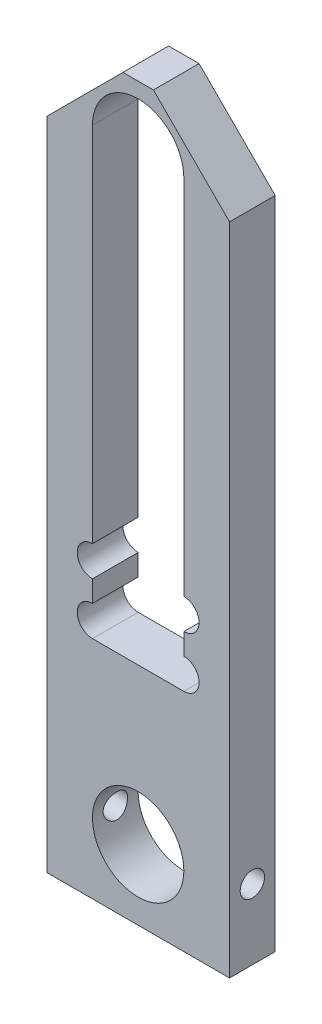
ISO-10303-21;
HEADER;
FILE_DESCRIPTION(('STEP AP214'),'2;1');
FILE_NAME('part.step','',(''),(''),'','','');
FILE_SCHEMA(('AUTOMOTIVE_DESIGN { 1 0 10303 214 1 1 1 1 }'));
ENDSEC;
DATA;
#1=APPLICATION_CONTEXT('core data for automotive mechanical design processes');
#2=APPLICATION_PROTOCOL_DEFINITION('international standard','automotive_design',2000,#1);
#3=PRODUCT_CONTEXT('',#1,'mechanical');
#4=PRODUCT('Part','Part','',(#3));
#5=PRODUCT_RELATED_PRODUCT_CATEGORY('part','',(#4));
#6=PRODUCT_DEFINITION_FORMATION('','',#4);
#7=PRODUCT_DEFINITION_CONTEXT('part definition',#1,'design');
#8=PRODUCT_DEFINITION('design','',#6,#7);
#9=PRODUCT_DEFINITION_SHAPE('','',#8);
#10=(LENGTH_UNIT() NAMED_UNIT(*) SI_UNIT(.MILLI.,.METRE.));
#11=(NAMED_UNIT(*) PLANE_ANGLE_UNIT() SI_UNIT($,.RADIAN.));
#12=(NAMED_UNIT(*) SI_UNIT($,.STERADIAN.) SOLID_ANGLE_UNIT());
#13=UNCERTAINTY_MEASURE_WITH_UNIT(LENGTH_MEASURE(1.E-05),#10,'distance_accuracy_value','');
#14=(GEOMETRIC_REPRESENTATION_CONTEXT(3) GLOBAL_UNCERTAINTY_ASSIGNED_CONTEXT((#13)) GLOBAL_UNIT_ASSIGNED_CONTEXT((#10,
#11,#12)) REPRESENTATION_CONTEXT('',''));
#15=CARTESIAN_POINT('',(0.,0.,0.));
#16=DIRECTION('',(0.,0.,1.));
#17=DIRECTION('',(1.,0.,0.));
#18=AXIS2_PLACEMENT_3D('',#15,#16,#17);
#19=CARTESIAN_POINT('',(0.,0.,15.));
#20=DIRECTION('',(1.,0.,0.));
#21=DIRECTION('',(0.,0.,-1.));
#22=AXIS2_PLACEMENT_3D('',#19,#20,#21);
#23=PLANE('',#22);
#24=CARTESIAN_POINT('',(0.,22.9999999999999,7.50000000000001));
#25=DIRECTION('',(-1.,0.,0.));
#26=DIRECTION('',(0.,0.,1.));
#27=AXIS2_PLACEMENT_3D('',#24,#25,#26);
#28=CIRCLE('',#27,4.);
#29=CARTESIAN_POINT('',(0.,22.9999999999999,11.5));
#30=VERTEX_POINT('',#29);
#31=EDGE_CURVE('E345',#30,#30,#28,.T.);
#32=ORIENTED_EDGE('',*,*,#31,.F.);
#33=EDGE_LOOP('',(#32));
#34=FACE_BOUND('',#33,.T.);
#35=DIRECTION('',(0.,-1.,0.));
#36=VECTOR('',#35,1.);
#37=CARTESIAN_POINT('',(0.,0.,0.));
#38=LINE('',#37,#36);
#39=CARTESIAN_POINT('',(4.44089209850063E-13,215.,0.));
#40=VERTEX_POINT('',#39);
#41=CARTESIAN_POINT('',(0.,0.,0.));
#42=VERTEX_POINT('',#41);
#43=EDGE_CURVE('E241',#40,#42,#38,.T.);
#44=ORIENTED_EDGE('',*,*,#43,.T.);
#45=DIRECTION('',(0.,0.,-1.));
#46=VECTOR('',#45,1.);
#47=CARTESIAN_POINT('',(0.,0.,15.));
#48=LINE('',#47,#46);
#49=CARTESIAN_POINT('',(0.,0.,15.));
#50=VERTEX_POINT('',#49);
#51=EDGE_CURVE('E11',#50,#42,#48,.T.);
#52=ORIENTED_EDGE('',*,*,#51,.F.);
#53=DIRECTION('',(0.,-1.,0.));
#54=VECTOR('',#53,1.);
#55=CARTESIAN_POINT('',(0.,0.,15.));
#56=LINE('',#55,#54);
#57=CARTESIAN_POINT('',(4.44089209850063E-13,215.,15.));
#58=VERTEX_POINT('',#57);
#59=EDGE_CURVE('E254',#58,#50,#56,.T.);
#60=ORIENTED_EDGE('',*,*,#59,.F.);
#61=DIRECTION('',(0.,0.,-1.));
#62=VECTOR('',#61,1.);
#63=CARTESIAN_POINT('',(4.44089209850063E-13,215.,15.));
#64=LINE('',#63,#62);
#65=EDGE_CURVE('E267',#58,#40,#64,.T.);
#66=ORIENTED_EDGE('',*,*,#65,.T.);
#67=EDGE_LOOP('',(#44,#52,#60,#66));
#68=FACE_BOUND('',#67,.T.);
#69=ADVANCED_FACE('F32',(#34,#68),#23,.F.);
#70=CARTESIAN_POINT('',(0.,0.,15.));
#71=DIRECTION('',(0.,1.,0.));
#72=DIRECTION('',(0.,0.,1.));
#73=AXIS2_PLACEMENT_3D('',#70,#71,#72);
#74=PLANE('',#73);
#75=DIRECTION('',(1.,0.,0.));
#76=VECTOR('',#75,1.);
#77=CARTESIAN_POINT('',(0.,0.,0.));
#78=LINE('',#77,#76);
#79=CARTESIAN_POINT('',(60.0000000000001,0.,0.));
#80=VERTEX_POINT('',#79);
#81=EDGE_CURVE('E244',#42,#80,#78,.T.);
#82=ORIENTED_EDGE('',*,*,#81,.T.);
#83=DIRECTION('',(0.,0.,-1.));
#84=VECTOR('',#83,1.);
#85=CARTESIAN_POINT('',(60.0000000000001,0.,15.));
#86=LINE('',#85,#84);
#87=CARTESIAN_POINT('',(60.0000000000001,0.,15.));
#88=VERTEX_POINT('',#87);
#89=EDGE_CURVE('E44',#88,#80,#86,.T.);
#90=ORIENTED_EDGE('',*,*,#89,.F.);
#91=DIRECTION('',(1.,0.,0.));
#92=VECTOR('',#91,1.);
#93=CARTESIAN_POINT('',(0.,0.,15.));
#94=LINE('',#93,#92);
#95=EDGE_CURVE('E257',#50,#88,#94,.T.);
#96=ORIENTED_EDGE('',*,*,#95,.F.);
#97=ORIENTED_EDGE('',*,*,#51,.T.);
#98=EDGE_LOOP('',(#82,#90,#96,#97));
#99=FACE_BOUND('',#98,.T.);
#100=ADVANCED_FACE('F335',(#99),#74,.F.);
#101=CARTESIAN_POINT('',(60.0000000000001,0.,15.));
#102=DIRECTION('',(-1.,0.,0.));
#103=DIRECTION('',(0.,0.,1.));
#104=AXIS2_PLACEMENT_3D('',#101,#102,#103);
#105=PLANE('',#104);
#106=CARTESIAN_POINT('',(60.0000000000001,22.9999999999997,7.4999999999999));
#107=DIRECTION('',(-1.,0.,0.));
#108=DIRECTION('',(0.,0.,1.));
#109=AXIS2_PLACEMENT_3D('',#106,#107,#108);
#110=CIRCLE('',#109,4.);
#111=CARTESIAN_POINT('',(60.0000000000001,22.9999999999997,11.4999999999999));
#112=VERTEX_POINT('',#111);
#113=EDGE_CURVE('E284',#112,#112,#110,.T.);
#114=ORIENTED_EDGE('',*,*,#113,.T.);
#115=EDGE_LOOP('',(#114));
#116=FACE_BOUND('',#115,.T.);
#117=DIRECTION('',(0.,1.,0.));
#118=VECTOR('',#117,1.);
#119=CARTESIAN_POINT('',(60.0000000000001,0.,0.));
#120=LINE('',#119,#118);
#121=CARTESIAN_POINT('',(60.0000000000001,215.,0.));
#122=VERTEX_POINT('',#121);
#123=EDGE_CURVE('E246',#80,#122,#120,.T.);
#124=ORIENTED_EDGE('',*,*,#123,.T.);
#125=DIRECTION('',(0.,0.,-1.));
#126=VECTOR('',#125,1.);
#127=CARTESIAN_POINT('',(60.0000000000001,215.,15.));
#128=LINE('',#127,#126);
#129=CARTESIAN_POINT('',(60.0000000000001,215.,15.));
#130=VERTEX_POINT('',#129);
#131=EDGE_CURVE('E276',#130,#122,#128,.T.);
#132=ORIENTED_EDGE('',*,*,#131,.F.);
#133=DIRECTION('',(0.,1.,0.));
#134=VECTOR('',#133,1.);
#135=CARTESIAN_POINT('',(60.0000000000001,0.,15.));
#136=LINE('',#135,#134);
#137=EDGE_CURVE('E259',#88,#130,#136,.T.);
#138=ORIENTED_EDGE('',*,*,#137,.F.);
#139=ORIENTED_EDGE('',*,*,#89,.T.);
#140=EDGE_LOOP('',(#124,#132,#138,#139));
#141=FACE_BOUND('',#140,.T.);
#142=ADVANCED_FACE('F340',(#116,#141),#105,.F.);
#143=CARTESIAN_POINT('',(35.0000000000001,240.,15.));
#144=DIRECTION('',(-0.707106781186548,-0.707106781186548,0.));
#145=DIRECTION('',(0.707106781186548,-0.707106781186547,0.));
#146=AXIS2_PLACEMENT_3D('',#143,#144,#145);
#147=PLANE('',#146);
#148=DIRECTION('',(-0.707106781186548,0.707106781186548,0.));
#149=VECTOR('',#148,1.);
#150=CARTESIAN_POINT('',(35.0000000000001,240.,0.));
#151=LINE('',#150,#149);
#152=CARTESIAN_POINT('',(35.0000000000001,240.,0.));
#153=VERTEX_POINT('',#152);
#154=EDGE_CURVE('E248',#122,#153,#151,.T.);
#155=ORIENTED_EDGE('',*,*,#154,.T.);
#156=DIRECTION('',(0.,0.,-1.));
#157=VECTOR('',#156,1.);
#158=CARTESIAN_POINT('',(35.0000000000001,240.,15.));
#159=LINE('',#158,#157);
#160=CARTESIAN_POINT('',(35.0000000000001,240.,15.));
#161=VERTEX_POINT('',#160);
#162=EDGE_CURVE('E273',#161,#153,#159,.T.);
#163=ORIENTED_EDGE('',*,*,#162,.F.);
#164=DIRECTION('',(-0.707106781186548,0.707106781186548,0.));
#165=VECTOR('',#164,1.);
#166=CARTESIAN_POINT('',(35.0000000000001,240.,15.));
#167=LINE('',#166,#165);
#168=EDGE_CURVE('E261',#130,#161,#167,.T.);
#169=ORIENTED_EDGE('',*,*,#168,.F.);
#170=ORIENTED_EDGE('',*,*,#131,.T.);
#171=EDGE_LOOP('',(#155,#163,#169,#170));
#172=FACE_BOUND('',#171,.T.);
#173=ADVANCED_FACE('F367',(#172),#147,.F.);
#174=CARTESIAN_POINT('',(24.9999999999999,240.,15.));
#175=DIRECTION('',(0.,-1.,0.));
#176=DIRECTION('',(0.,0.,-1.));
#177=AXIS2_PLACEMENT_3D('',#174,#175,#176);
#178=PLANE('',#177);
#179=DIRECTION('',(-1.,0.,0.));
#180=VECTOR('',#179,1.);
#181=CARTESIAN_POINT('',(25.0000000000004,240.,0.));
#182=LINE('',#181,#180);
#183=CARTESIAN_POINT('',(25.0000000000004,240.,0.));
#184=VERTEX_POINT('',#183);
#185=EDGE_CURVE('E250',#153,#184,#182,.T.);
#186=ORIENTED_EDGE('',*,*,#185,.T.);
#187=DIRECTION('',(0.,0.,-1.));
#188=VECTOR('',#187,1.);
#189=CARTESIAN_POINT('',(24.9999999999999,240.,15.));
#190=LINE('',#189,#188);
#191=CARTESIAN_POINT('',(24.9999999999999,240.,15.));
#192=VERTEX_POINT('',#191);
#193=EDGE_CURVE('E270',#192,#184,#190,.T.);
#194=ORIENTED_EDGE('',*,*,#193,.F.);
#195=DIRECTION('',(-1.,0.,0.));
#196=VECTOR('',#195,1.);
#197=CARTESIAN_POINT('',(24.9999999999999,240.,15.));
#198=LINE('',#197,#196);
#199=EDGE_CURVE('E263',#161,#192,#198,.T.);
#200=ORIENTED_EDGE('',*,*,#199,.F.);
#201=ORIENTED_EDGE('',*,*,#162,.T.);
#202=EDGE_LOOP('',(#186,#194,#200,#201));
#203=FACE_BOUND('',#202,.T.);
#204=ADVANCED_FACE('F364',(#203),#178,.F.);
#205=CARTESIAN_POINT('',(4.44089209850063E-13,215.,15.));
#206=DIRECTION('',(0.707106781186547,-0.707106781186548,0.));
#207=DIRECTION('',(0.707106781186548,0.707106781186547,0.));
#208=AXIS2_PLACEMENT_3D('',#205,#206,#207);
#209=PLANE('',#208);
#210=DIRECTION('',(-0.707106781186548,-0.707106781186547,0.));
#211=VECTOR('',#210,1.);
#212=CARTESIAN_POINT('',(4.44089209850063E-13,215.,0.));
#213=LINE('',#212,#211);
#214=EDGE_CURVE('E252',#184,#40,#213,.T.);
#215=ORIENTED_EDGE('',*,*,#214,.T.);
#216=ORIENTED_EDGE('',*,*,#65,.F.);
#217=DIRECTION('',(-0.707106781186548,-0.707106781186547,0.));
#218=VECTOR('',#217,1.);
#219=CARTESIAN_POINT('',(4.44089209850063E-13,215.,15.));
#220=LINE('',#219,#218);
#221=EDGE_CURVE('E265',#192,#58,#220,.T.);
#222=ORIENTED_EDGE('',*,*,#221,.F.);
#223=ORIENTED_EDGE('',*,*,#193,.T.);
#224=EDGE_LOOP('',(#215,#216,#222,#223));
#225=FACE_BOUND('',#224,.T.);
#226=ADVANCED_FACE('F362',(#225),#209,.F.);
#227=CARTESIAN_POINT('',(0.,240.,15.));
#228=DIRECTION('',(0.,0.,-1.));
#229=DIRECTION('',(-1.,0.,0.));
#230=AXIS2_PLACEMENT_3D('',#227,#228,#229);
#231=PLANE('',#230);
#232=DIRECTION('',(0.,-1.,0.));
#233=VECTOR('',#232,1.);
#234=CARTESIAN_POINT('',(15.0000000000001,220.,15.));
#235=LINE('',#234,#233);
#236=CARTESIAN_POINT('',(15.0000000000001,220.,15.));
#237=VERTEX_POINT('',#236);
#238=CARTESIAN_POINT('',(15.0000000000001,101.,15.));
#239=VERTEX_POINT('',#238);
#240=EDGE_CURVE('E161',#237,#239,#235,.T.);
#241=ORIENTED_EDGE('',*,*,#240,.F.);
#242=CARTESIAN_POINT('',(29.9999999999998,220.,15.));
#243=DIRECTION('',(0.,0.,1.));
#244=DIRECTION('',(1.,0.,0.));
#245=AXIS2_PLACEMENT_3D('',#242,#243,#244);
#246=CIRCLE('',#245,15.);
#247=CARTESIAN_POINT('',(44.9999999999999,220.,15.));
#248=VERTEX_POINT('',#247);
#249=EDGE_CURVE('E52',#248,#237,#246,.T.);
#250=ORIENTED_EDGE('',*,*,#249,.F.);
#251=DIRECTION('',(0.,1.,0.));
#252=VECTOR('',#251,1.);
#253=CARTESIAN_POINT('',(44.9999999999999,220.,15.));
#254=LINE('',#253,#252);
#255=CARTESIAN_POINT('',(45.0000000000004,101.,15.0000000000001));
#256=VERTEX_POINT('',#255);
#257=EDGE_CURVE('E189',#256,#248,#254,.T.);
#258=ORIENTED_EDGE('',*,*,#257,.F.);
#259=CARTESIAN_POINT('',(45.0000000000004,95.9999999999995,15.0000000000001));
#260=DIRECTION('',(0.,0.,1.));
#261=DIRECTION('',(1.,0.,0.));
#262=AXIS2_PLACEMENT_3D('',#259,#260,#261);
#263=CIRCLE('',#262,5.);
#264=CARTESIAN_POINT('',(44.9999999999999,91.,15.0000000000001));
#265=VERTEX_POINT('',#264);
#266=EDGE_CURVE('E186',#265,#256,#263,.T.);
#267=ORIENTED_EDGE('',*,*,#266,.F.);
#268=DIRECTION('',(0.,1.,0.));
#269=VECTOR('',#268,1.);
#270=CARTESIAN_POINT('',(44.9999999999999,91.,15.0000000000001));
#271=LINE('',#270,#269);
#272=CARTESIAN_POINT('',(44.9999999999999,84.,15.0000000000001));
#273=VERTEX_POINT('',#272);
#274=EDGE_CURVE('E183',#273,#265,#271,.T.);
#275=ORIENTED_EDGE('',*,*,#274,.F.);
#276=CARTESIAN_POINT('',(44.9999999999999,78.9999999999996,15.0000000000001));
#277=DIRECTION('',(0.,0.,1.));
#278=DIRECTION('',(1.,0.,0.));
#279=AXIS2_PLACEMENT_3D('',#276,#277,#278);
#280=CIRCLE('',#279,5.);
#281=CARTESIAN_POINT('',(45.0000000000004,74.,15.0000000000001));
#282=VERTEX_POINT('',#281);
#283=EDGE_CURVE('E180',#282,#273,#280,.T.);
#284=ORIENTED_EDGE('',*,*,#283,.F.);
#285=DIRECTION('',(1.,0.,0.));
#286=VECTOR('',#285,1.);
#287=CARTESIAN_POINT('',(15.0000000000001,73.9999999999997,15.));
#288=LINE('',#287,#286);
#289=CARTESIAN_POINT('',(15.0000000000001,73.9999999999997,15.));
#290=VERTEX_POINT('',#289);
#291=EDGE_CURVE('E177',#290,#282,#288,.T.);
#292=ORIENTED_EDGE('',*,*,#291,.F.);
#293=CARTESIAN_POINT('',(15.0000000000001,78.9999999999997,15.));
#294=DIRECTION('',(0.,0.,1.));
#295=DIRECTION('',(1.,0.,0.));
#296=AXIS2_PLACEMENT_3D('',#293,#294,#295);
#297=CIRCLE('',#296,5.);
#298=CARTESIAN_POINT('',(15.0000000000001,84.0000000000001,15.));
#299=VERTEX_POINT('',#298);
#300=EDGE_CURVE('E171',#299,#290,#297,.T.);
#301=ORIENTED_EDGE('',*,*,#300,.F.);
#302=DIRECTION('',(0.,-1.,0.));
#303=VECTOR('',#302,1.);
#304=CARTESIAN_POINT('',(15.0000000000001,91.0000000000002,15.));
#305=LINE('',#304,#303);
#306=CARTESIAN_POINT('',(15.0000000000001,91.0000000000002,15.));
#307=VERTEX_POINT('',#306);
#308=EDGE_CURVE('E169',#307,#299,#305,.T.);
#309=ORIENTED_EDGE('',*,*,#308,.F.);
#310=CARTESIAN_POINT('',(15.0000000000001,95.9999999999998,15.));
#311=DIRECTION('',(0.,0.,1.));
#312=DIRECTION('',(1.,0.,0.));
#313=AXIS2_PLACEMENT_3D('',#310,#311,#312);
#314=CIRCLE('',#313,5.);
#315=EDGE_CURVE('E152',#239,#307,#314,.T.);
#316=ORIENTED_EDGE('',*,*,#315,.F.);
#317=EDGE_LOOP('',(#241,#250,#258,#267,#275,#284,#292,#301,#309,#316));
#318=FACE_BOUND('',#317,.T.);
#319=CARTESIAN_POINT('',(29.9999999999998,23.,15.));
#320=DIRECTION('',(0.,0.,1.));
#321=DIRECTION('',(1.,0.,0.));
#322=AXIS2_PLACEMENT_3D('',#319,#320,#321);
#323=CIRCLE('',#322,15.);
#324=CARTESIAN_POINT('',(44.9999999999998,23.,15.));
#325=VERTEX_POINT('',#324);
#326=EDGE_CURVE('E221',#325,#325,#323,.T.);
#327=ORIENTED_EDGE('',*,*,#326,.F.);
#328=EDGE_LOOP('',(#327));
#329=FACE_BOUND('',#328,.T.);
#330=ORIENTED_EDGE('',*,*,#59,.T.);
#331=ORIENTED_EDGE('',*,*,#95,.T.);
#332=ORIENTED_EDGE('',*,*,#137,.T.);
#333=ORIENTED_EDGE('',*,*,#168,.T.);
#334=ORIENTED_EDGE('',*,*,#199,.T.);
#335=ORIENTED_EDGE('',*,*,#221,.T.);
#336=EDGE_LOOP('',(#330,#331,#332,#333,#334,#335));
#337=FACE_BOUND('',#336,.T.);
#338=ADVANCED_FACE('F165',(#318,#329,#337),#231,.F.);
#339=CARTESIAN_POINT('',(4.44089209850063E-13,240.,0.));
#340=DIRECTION('',(0.,0.,-1.));
#341=DIRECTION('',(-1.,0.,0.));
#342=AXIS2_PLACEMENT_3D('',#339,#340,#341);
#343=PLANE('',#342);
#344=CARTESIAN_POINT('',(29.9999999999998,220.,0.));
#345=DIRECTION('',(0.,0.,1.));
#346=DIRECTION('',(1.,0.,0.));
#347=AXIS2_PLACEMENT_3D('',#344,#345,#346);
#348=CIRCLE('',#347,15.);
#349=CARTESIAN_POINT('',(45.0000000000004,220.,0.));
#350=VERTEX_POINT('',#349);
#351=CARTESIAN_POINT('',(15.0000000000001,220.,0.));
#352=VERTEX_POINT('',#351);
#353=EDGE_CURVE('E192',#350,#352,#348,.T.);
#354=ORIENTED_EDGE('',*,*,#353,.T.);
#355=DIRECTION('',(0.,-1.,0.));
#356=VECTOR('',#355,1.);
#357=CARTESIAN_POINT('',(15.0000000000001,220.,0.));
#358=LINE('',#357,#356);
#359=CARTESIAN_POINT('',(15.0000000000001,101.,0.));
#360=VERTEX_POINT('',#359);
#361=EDGE_CURVE('E195',#352,#360,#358,.T.);
#362=ORIENTED_EDGE('',*,*,#361,.T.);
#363=CARTESIAN_POINT('',(15.0000000000001,95.9999999999998,0.));
#364=DIRECTION('',(0.,0.,1.));
#365=DIRECTION('',(1.,0.,0.));
#366=AXIS2_PLACEMENT_3D('',#363,#364,#365);
#367=CIRCLE('',#366,5.);
#368=CARTESIAN_POINT('',(15.0000000000001,91.0000000000002,0.));
#369=VERTEX_POINT('',#368);
#370=EDGE_CURVE('E60',#360,#369,#367,.T.);
#371=ORIENTED_EDGE('',*,*,#370,.T.);
#372=DIRECTION('',(0.,-1.,0.));
#373=VECTOR('',#372,1.);
#374=CARTESIAN_POINT('',(15.0000000000001,91.0000000000002,0.));
#375=LINE('',#374,#373);
#376=CARTESIAN_POINT('',(15.0000000000001,83.9999999999996,0.));
#377=VERTEX_POINT('',#376);
#378=EDGE_CURVE('E198',#369,#377,#375,.T.);
#379=ORIENTED_EDGE('',*,*,#378,.T.);
#380=CARTESIAN_POINT('',(15.0000000000001,78.9999999999997,0.));
#381=DIRECTION('',(0.,0.,1.));
#382=DIRECTION('',(1.,0.,0.));
#383=AXIS2_PLACEMENT_3D('',#380,#381,#382);
#384=CIRCLE('',#383,5.);
#385=CARTESIAN_POINT('',(15.0000000000001,73.9999999999997,0.));
#386=VERTEX_POINT('',#385);
#387=EDGE_CURVE('E201',#377,#386,#384,.T.);
#388=ORIENTED_EDGE('',*,*,#387,.T.);
#389=DIRECTION('',(1.,0.,0.));
#390=VECTOR('',#389,1.);
#391=CARTESIAN_POINT('',(15.0000000000001,73.9999999999997,0.));
#392=LINE('',#391,#390);
#393=CARTESIAN_POINT('',(44.9999999999999,74.0000000000001,1.11022302462516E-13));
#394=VERTEX_POINT('',#393);
#395=EDGE_CURVE('E204',#386,#394,#392,.T.);
#396=ORIENTED_EDGE('',*,*,#395,.T.);
#397=CARTESIAN_POINT('',(44.9999999999999,78.9999999999996,1.11022302462516E-13));
#398=DIRECTION('',(0.,0.,1.));
#399=DIRECTION('',(1.,0.,0.));
#400=AXIS2_PLACEMENT_3D('',#397,#398,#399);
#401=CIRCLE('',#400,5.);
#402=CARTESIAN_POINT('',(44.9999999999999,84.,1.11022302462516E-13));
#403=VERTEX_POINT('',#402);
#404=EDGE_CURVE('E207',#394,#403,#401,.T.);
#405=ORIENTED_EDGE('',*,*,#404,.T.);
#406=DIRECTION('',(0.,1.,0.));
#407=VECTOR('',#406,1.);
#408=CARTESIAN_POINT('',(44.9999999999999,91.,1.11022302462516E-13));
#409=LINE('',#408,#407);
#410=CARTESIAN_POINT('',(44.9999999999999,91.,1.11022302462516E-13));
#411=VERTEX_POINT('',#410);
#412=EDGE_CURVE('E210',#403,#411,#409,.T.);
#413=ORIENTED_EDGE('',*,*,#412,.T.);
#414=CARTESIAN_POINT('',(45.0000000000004,95.9999999999995,1.11022302462516E-13));
#415=DIRECTION('',(0.,0.,1.));
#416=DIRECTION('',(1.,0.,0.));
#417=AXIS2_PLACEMENT_3D('',#414,#415,#416);
#418=CIRCLE('',#417,5.);
#419=CARTESIAN_POINT('',(45.0000000000004,101.,1.11022302462516E-13));
#420=VERTEX_POINT('',#419);
#421=EDGE_CURVE('E213',#411,#420,#418,.T.);
#422=ORIENTED_EDGE('',*,*,#421,.T.);
#423=DIRECTION('',(0.,1.,0.));
#424=VECTOR('',#423,1.);
#425=CARTESIAN_POINT('',(45.0000000000004,220.,0.));
#426=LINE('',#425,#424);
#427=EDGE_CURVE('E216',#420,#350,#426,.T.);
#428=ORIENTED_EDGE('',*,*,#427,.T.);
#429=EDGE_LOOP('',(#354,#362,#371,#379,#388,#396,#405,#413,#422,#428));
#430=FACE_BOUND('',#429,.T.);
#431=CARTESIAN_POINT('',(29.9999999999998,23.,0.));
#432=DIRECTION('',(0.,0.,1.));
#433=DIRECTION('',(1.,0.,0.));
#434=AXIS2_PLACEMENT_3D('',#431,#432,#433);
#435=CIRCLE('',#434,15.);
#436=CARTESIAN_POINT('',(44.9999999999998,23.,0.));
#437=VERTEX_POINT('',#436);
#438=EDGE_CURVE('E238',#437,#437,#435,.T.);
#439=ORIENTED_EDGE('',*,*,#438,.T.);
#440=EDGE_LOOP('',(#439));
#441=FACE_BOUND('',#440,.T.);
#442=ORIENTED_EDGE('',*,*,#43,.F.);
#443=ORIENTED_EDGE('',*,*,#214,.F.);
#444=ORIENTED_EDGE('',*,*,#185,.F.);
#445=ORIENTED_EDGE('',*,*,#154,.F.);
#446=ORIENTED_EDGE('',*,*,#123,.F.);
#447=ORIENTED_EDGE('',*,*,#81,.F.);
#448=EDGE_LOOP('',(#442,#443,#444,#445,#446,#447));
#449=FACE_BOUND('',#448,.T.);
#450=ADVANCED_FACE('F332',(#430,#441,#449),#343,.T.);
#451=CARTESIAN_POINT('',(29.9999999999998,23.,0.));
#452=DIRECTION('',(0.,0.,1.));
#453=DIRECTION('',(1.,0.,0.));
#454=AXIS2_PLACEMENT_3D('',#451,#452,#453);
#455=CYLINDRICAL_SURFACE('',#454,15.);
#456=CARTESIAN_POINT('',(45.0000000000004,22.9999999999996,3.49999999999989));
#457=CARTESIAN_POINT('',(44.9999966762037,23.2205091116653,3.5000052338696));
#458=CARTESIAN_POINT('',(44.995089723243,23.4410743204433,3.51829522837924));
#459=CARTESIAN_POINT('',(44.9759914724328,23.8758509027086,3.59084246147727));
#460=CARTESIAN_POINT('',(44.9617957066515,24.0900591666379,3.64511700885211));
#461=CARTESIAN_POINT('',(44.9256866650557,24.5057831780905,3.78774333372803));
#462=CARTESIAN_POINT('',(44.9037833426073,24.7073149020304,3.87605117533211));
#463=CARTESIAN_POINT('',(44.8545739830334,25.0927073727854,4.08407448533325));
#464=CARTESIAN_POINT('',(44.8272675859035,25.2765669408995,4.20379204671844));
#465=CARTESIAN_POINT('',(44.7694922980397,25.6256590074802,4.4741670328266));
#466=CARTESIAN_POINT('',(44.7389693535733,25.7904233797255,4.62541733601653));
#467=CARTESIAN_POINT('',(44.6785481935918,26.0925742732125,4.95329696612676));
#468=CARTESIAN_POINT('',(44.6486500589452,26.2299572699131,5.12992955523501));
#469=CARTESIAN_POINT('',(44.5923107492878,26.4757281848681,5.50729646965079));
#470=CARTESIAN_POINT('',(44.5659377712648,26.5835775547294,5.70839265652337));
#471=CARTESIAN_POINT('',(44.5204295463635,26.7637509615396,6.12668022218479));
#472=CARTESIAN_POINT('',(44.5012929650651,26.8360815490272,6.3438686246628));
#473=CARTESIAN_POINT('',(44.4729823160477,26.9415384045298,6.78299107564994));
#474=CARTESIAN_POINT('',(44.4635929562295,26.9755134048934,7.00470707986139));
#475=CARTESIAN_POINT('',(44.4551966183275,27.0059406941162,7.450875366613));
#476=CARTESIAN_POINT('',(44.4561877002895,27.0023999941152,7.67532713004806));
#477=CARTESIAN_POINT('',(44.4682475760412,26.958570200054,8.11397083074801));
#478=CARTESIAN_POINT('',(44.4790347102306,26.919308121295,8.32827436407681));
#479=CARTESIAN_POINT('',(44.5090202616135,26.8067949744433,8.74713666891236));
#480=CARTESIAN_POINT('',(44.5282193510523,26.7335411898599,8.95169466015064));
#481=CARTESIAN_POINT('',(44.5731132349678,26.5542871393052,9.34793628761709));
#482=CARTESIAN_POINT('',(44.598878856374,26.4479268227555,9.53944867857235));
#483=CARTESIAN_POINT('',(44.6539645928487,26.2057300764752,9.90226831770289));
#484=CARTESIAN_POINT('',(44.6832854071037,26.0698878444848,10.0735715783129));
#485=CARTESIAN_POINT('',(44.7433502125972,25.7673321452682,10.3969779949096));
#486=CARTESIAN_POINT('',(44.7741094297763,25.5997562545657,10.5482726366298));
#487=CARTESIAN_POINT('',(44.8327276255263,25.2412353364124,10.8207775607004));
#488=CARTESIAN_POINT('',(44.8605864897715,25.0502893884099,10.9419866574047));
#489=CARTESIAN_POINT('',(44.9104364079662,24.6491965109946,11.1512358056492));
#490=CARTESIAN_POINT('',(44.9324014566711,24.4389698051032,11.2391295408971));
#491=CARTESIAN_POINT('',(44.9678008880198,24.0060045887805,11.3780943776267));
#492=CARTESIAN_POINT('',(44.9812371346752,23.7832688238564,11.4291735254479));
#493=CARTESIAN_POINT('',(44.9977831711679,23.3385081662908,11.4917897538356));
#494=CARTESIAN_POINT('',(45.001179949419,23.1166484752825,11.5044260797016));
#495=CARTESIAN_POINT('',(44.9980894338337,22.6739799081974,11.492833671506));
#496=CARTESIAN_POINT('',(44.9916031616072,22.4531709258756,11.4686087477884));
#497=CARTESIAN_POINT('',(44.9696607099205,22.0227951001963,11.38488310508));
#498=CARTESIAN_POINT('',(44.9543605309263,21.8131002959443,11.3259955076044));
#499=CARTESIAN_POINT('',(44.9165258978827,21.4065860576477,11.1753281109841));
#500=CARTESIAN_POINT('',(44.8939906599237,21.2097680215678,11.0835447474988));
#501=CARTESIAN_POINT('',(44.8435132111907,20.830323050664,10.8676522256389));
#502=CARTESIAN_POINT('',(44.8154737320983,20.6480496230775,10.7429450664046));
#503=CARTESIAN_POINT('',(44.7572290473116,20.3066307292056,10.4654967396841));
#504=CARTESIAN_POINT('',(44.7270234145529,20.1474898424016,10.3127500347979));
#505=CARTESIAN_POINT('',(44.6667949173318,19.8522215104245,9.97842884501075));
#506=CARTESIAN_POINT('',(44.6368012285769,19.7168696150036,9.79616287720946));
#507=CARTESIAN_POINT('',(44.5813289436634,19.4786561762972,9.41087060780097));
#508=CARTESIAN_POINT('',(44.5558501591604,19.3757932775561,9.20784517275608));
#509=CARTESIAN_POINT('',(44.5125853674306,19.2062517682774,8.78780938584715));
#510=CARTESIAN_POINT('',(44.4947549662344,19.1393637549212,8.57088837636242));
#511=CARTESIAN_POINT('',(44.4687965026611,19.0431758976232,8.12832136065289));
#512=CARTESIAN_POINT('',(44.4606659608684,19.0138664479475,7.90267759931316));
#513=CARTESIAN_POINT('',(44.4552348910195,18.9942202069277,7.45701042421131));
#514=CARTESIAN_POINT('',(44.457587953202,19.0026368876484,7.23704535942655));
#515=CARTESIAN_POINT('',(44.4720479199636,19.0553124800012,6.80179297192941));
#516=CARTESIAN_POINT('',(44.4841545735456,19.0995704693002,6.58650552899041));
#517=CARTESIAN_POINT('',(44.516551421902,19.2219496860021,6.16828849575972));
#518=CARTESIAN_POINT('',(44.5367777005103,19.2998067784872,5.96527631454074));
#519=CARTESIAN_POINT('',(44.5831363626056,19.4869689087529,5.57504233892635));
#520=CARTESIAN_POINT('',(44.6092696723954,19.5962788795075,5.38782302739747));
#521=CARTESIAN_POINT('',(44.6654584288422,19.8470218146229,5.02853928100812));
#522=CARTESIAN_POINT('',(44.6956066620423,19.9893054046414,4.85708293004785));
#523=CARTESIAN_POINT('',(44.7559100756512,20.3003389297778,4.54007509666488));
#524=CARTESIAN_POINT('',(44.7860652559669,20.4690952912822,4.39452992266216));
#525=CARTESIAN_POINT('',(44.8437562480822,20.8326400378223,4.13041552470632));
#526=CARTESIAN_POINT('',(44.8712222262915,21.0279080764962,4.01248997870123));
#527=CARTESIAN_POINT('',(44.919676202057,21.436222719166,3.8113251681411));
#528=CARTESIAN_POINT('',(44.940668353672,21.6492578106072,3.72806364867271));
#529=CARTESIAN_POINT('',(44.9710950502697,22.0512505902378,3.60944942916891));
#530=CARTESIAN_POINT('',(44.9818554118518,22.2384759668697,3.56850123281491));
#531=CARTESIAN_POINT('',(44.9963089807289,22.6171204093655,3.51377558766576));
#532=CARTESIAN_POINT('',(45.0000028859457,22.8085390591899,3.49999545559984));
#533=CARTESIAN_POINT('',(45.0000000000004,22.9999999999996,3.49999999999989));
#534=B_SPLINE_CURVE_WITH_KNOTS('',3,(#456,#457,#458,#459,#460,#461,#462,#463,#464,#465,#466,
#467,#468,#469,#470,#471,#472,#473,#474,#475,#476,#477,#478,#479,#480,#481,#482,#483,#484,#485,
#486,#487,#488,#489,#490,#491,#492,#493,#494,#495,#496,#497,#498,#499,#500,#501,#502,#503,#504,
#505,#506,#507,#508,#509,#510,#511,#512,#513,#514,#515,#516,#517,#518,#519,#520,#521,#522,#523,
#524,#525,#526,#527,#528,#529,#530,#531,#532,#533),.UNSPECIFIED.,.T.,.F.,(4,2,2,2,2,2,2,2,2,2,2,
2,2,2,2,2,2,2,2,2,2,2,2,2,2,2,2,2,2,2,2,2,2,2,2,2,2,2,4),(0.,0.660825197899229,1.32196848752313,
1.9822611059443,2.6425977341741,3.31669795909968,3.99088489850312,4.6766516504648,
5.36229188259424,6.03244316500957,6.7024692080866,7.35382004092012,8.00522293625896,
8.66397346693017,9.32285376235284,10.0032251962467,10.6836234387523,11.3669761920612,
12.0501795438031,12.7136543504912,13.3770605785072,14.0290707128425,14.6811515155124,
15.3460057200911,16.0109913651778,16.694729927656,17.3784399604824,18.058125953988,
18.73763817328,19.3948668481093,20.0520786104841,20.7042153090382,21.3564543425321,
22.0278867914999,22.6994824867212,23.3854450456902,24.0709665229759,24.6447963799389,
25.2185695593997),.UNSPECIFIED.);
#535=CARTESIAN_POINT('',(45.0000000000004,22.9999999999996,3.49999999999989));
#536=VERTEX_POINT('',#535);
#537=EDGE_CURVE('E35',#536,#536,#534,.T.);
#538=ORIENTED_EDGE('',*,*,#537,.T.);
#539=EDGE_LOOP('',(#538));
#540=FACE_BOUND('',#539,.T.);
#541=CARTESIAN_POINT('',(15.0000000000006,22.9999999999999,11.5));
#542=CARTESIAN_POINT('',(15.0000033237974,23.2205091116656,11.4999947661303));
#543=CARTESIAN_POINT('',(15.0049102767569,23.4410743204435,11.4817047716205));
#544=CARTESIAN_POINT('',(15.0240085275665,23.8758509027087,11.4091575385225));
#545=CARTESIAN_POINT('',(15.0382042933485,24.0900591666379,11.3548829911477));
#546=CARTESIAN_POINT('',(15.0743133349444,24.5057831780903,11.2122566662719));
#547=CARTESIAN_POINT('',(15.0962166573923,24.7073149020303,11.1239488246678));
#548=CARTESIAN_POINT('',(15.1454260169662,25.0927073727851,10.9159255146666));
#549=CARTESIAN_POINT('',(15.1727324140966,25.2765669408991,10.7962079532814));
#550=CARTESIAN_POINT('',(15.2305077019604,25.6256590074798,10.5258329671733));
#551=CARTESIAN_POINT('',(15.2610306464263,25.7904233797253,10.3745826639833));
#552=CARTESIAN_POINT('',(15.3214518064078,26.0925742732125,10.0467030338732));
#553=CARTESIAN_POINT('',(15.3513499410548,26.2299572699132,9.87007044476494));
#554=CARTESIAN_POINT('',(15.4076892507122,26.4757281848682,9.49270353034912));
#555=CARTESIAN_POINT('',(15.4340622287348,26.5835775547294,9.29160734347645));
#556=CARTESIAN_POINT('',(15.4795704536361,26.7637509615396,8.87331977781503));
#557=CARTESIAN_POINT('',(15.498707034935,26.8360815490273,8.65613137533709));
#558=CARTESIAN_POINT('',(15.5270176839523,26.94153840453,8.21700892434997));
#559=CARTESIAN_POINT('',(15.53640704377,26.9755134048935,7.99529292013849));
#560=CARTESIAN_POINT('',(15.5448033816722,27.0059406941161,7.54912463338686));
#561=CARTESIAN_POINT('',(15.543812299711,27.002399994115,7.32467286995183));
#562=CARTESIAN_POINT('',(15.5317524239593,26.958570200054,6.88602916925188));
#563=CARTESIAN_POINT('',(15.520965289769,26.9193081212951,6.67172563592305));
#564=CARTESIAN_POINT('',(15.4909797383861,26.8067949744432,6.25286333108753));
#565=CARTESIAN_POINT('',(15.4717806489482,26.7335411898594,6.04830533984929));
#566=CARTESIAN_POINT('',(15.4268867650327,26.5542871393046,5.65206371238287));
#567=CARTESIAN_POINT('',(15.4011211436258,26.4479268227553,5.46055132142757));
#568=CARTESIAN_POINT('',(15.3460354071508,26.2057300764755,5.097731682297));
#569=CARTESIAN_POINT('',(15.3167145928963,26.0698878444851,4.926428421687));
#570=CARTESIAN_POINT('',(15.2566497874029,25.7673321452686,4.60302200509038));
#571=CARTESIAN_POINT('',(15.2258905702232,25.5997562545661,4.45172736337023));
#572=CARTESIAN_POINT('',(15.1672723744735,25.2412353364127,4.17922243929961));
#573=CARTESIAN_POINT('',(15.139413510229,25.0502893884102,4.05801334259521));
#574=CARTESIAN_POINT('',(15.0895635920342,24.6491965109949,3.84876419435062));
#575=CARTESIAN_POINT('',(15.0675985433285,24.4389698051035,3.76087045910272));
#576=CARTESIAN_POINT('',(15.0321991119798,24.0060045887805,3.62190562237321));
#577=CARTESIAN_POINT('',(15.0187628653253,23.7832688238562,3.5708264745521));
#578=CARTESIAN_POINT('',(15.0022168288326,23.3385081662906,3.50821024616434));
#579=CARTESIAN_POINT('',(14.9988200505806,23.1166484752824,3.49557392029815));
#580=CARTESIAN_POINT('',(15.0019105661659,22.6739799081974,3.50716632849379));
#581=CARTESIAN_POINT('',(15.0083968383933,22.4531709258757,3.53139125221156));
#582=CARTESIAN_POINT('',(15.03033929008,22.0227951001963,3.61511689491995));
#583=CARTESIAN_POINT('',(15.0456394690733,21.8131002959442,3.67400449239541));
#584=CARTESIAN_POINT('',(15.083474102117,21.4065860576476,3.82467188901576));
#585=CARTESIAN_POINT('',(15.1060093400768,21.2097680215677,3.91645525250107));
#586=CARTESIAN_POINT('',(15.1564867888099,20.8303230506639,4.13234777436106));
#587=CARTESIAN_POINT('',(15.1845262679014,20.6480496230773,4.25705493359536));
#588=CARTESIAN_POINT('',(15.2427709526879,20.3066307292055,4.53450326031585));
#589=CARTESIAN_POINT('',(15.2729765854472,20.1474898424016,4.68724996520208));
#590=CARTESIAN_POINT('',(15.3332050826682,19.8522215104245,5.02157115498921));
#591=CARTESIAN_POINT('',(15.3631987714226,19.7168696150034,5.20383712279046));
#592=CARTESIAN_POINT('',(15.4186710563364,19.4786561762972,5.58912939219897));
#593=CARTESIAN_POINT('',(15.4441498408401,19.3757932775564,5.79215482724392));
#594=CARTESIAN_POINT('',(15.4874146325698,19.2062517682778,6.21219061415286));
#595=CARTESIAN_POINT('',(15.5052450337652,19.1393637549213,6.42911162363754));
#596=CARTESIAN_POINT('',(15.5312034973385,19.0431758976231,6.87167863934702));
#597=CARTESIAN_POINT('',(15.5393340391321,19.0138664479476,7.09732240068676));
#598=CARTESIAN_POINT('',(15.5447651089811,18.9942202069278,7.54298957578859));
#599=CARTESIAN_POINT('',(15.5424120467977,19.0026368876485,7.76295464057332));
#600=CARTESIAN_POINT('',(15.5279520800359,19.055312480001,8.19820702807051));
#601=CARTESIAN_POINT('',(15.5158454264545,19.0995704692998,8.41349447100957));
#602=CARTESIAN_POINT('',(15.483448578098,19.2219496860017,8.83171150424027));
#603=CARTESIAN_POINT('',(15.4632222994893,19.299806778487,9.03472368545918));
#604=CARTESIAN_POINT('',(15.4168636373941,19.4869689087532,9.42495766107351));
#605=CARTESIAN_POINT('',(15.3907303276047,19.5962788795079,9.61217697260238));
#606=CARTESIAN_POINT('',(15.3345415711578,19.8470218146233,9.9714607189918));
#607=CARTESIAN_POINT('',(15.3043933379571,19.9893054046416,10.1429170699522));
#608=CARTESIAN_POINT('',(15.2440899243487,20.300338929778,10.4599249033351));
#609=CARTESIAN_POINT('',(15.2139347440341,20.4690952912827,10.6054700773378));
#610=CARTESIAN_POINT('',(15.1562437519187,20.8326400378229,10.8695844752935));
#611=CARTESIAN_POINT('',(15.1287777737082,21.0279080764965,10.9875100212986));
#612=CARTESIAN_POINT('',(15.0803237979425,21.4362227191661,11.1886748318588));
#613=CARTESIAN_POINT('',(15.0593316463286,21.6492578106073,11.2719363513272));
#614=CARTESIAN_POINT('',(15.0289049497307,22.0512505902379,11.390550570831));
#615=CARTESIAN_POINT('',(15.0181445881477,22.2384759668698,11.4314987671849));
#616=CARTESIAN_POINT('',(15.0036910192708,22.6171204093657,11.4862244123341));
#617=CARTESIAN_POINT('',(14.9999971140551,22.8085390591902,11.5000045444001));
#618=CARTESIAN_POINT('',(15.0000000000006,22.9999999999999,11.5));
#619=B_SPLINE_CURVE_WITH_KNOTS('',3,(#541,#542,#543,#544,#545,#546,#547,#548,#549,#550,#551,
#552,#553,#554,#555,#556,#557,#558,#559,#560,#561,#562,#563,#564,#565,#566,#567,#568,#569,#570,
#571,#572,#573,#574,#575,#576,#577,#578,#579,#580,#581,#582,#583,#584,#585,#586,#587,#588,#589,
#590,#591,#592,#593,#594,#595,#596,#597,#598,#599,#600,#601,#602,#603,#604,#605,#606,#607,#608,
#609,#610,#611,#612,#613,#614,#615,#616,#617,#618),.UNSPECIFIED.,.T.,.F.,(4,2,2,2,2,2,2,2,2,2,2,
2,2,2,2,2,2,2,2,2,2,2,2,2,2,2,2,2,2,2,2,2,2,2,2,2,2,2,4),(0.,0.660825197899031,1.32196848752267,
1.98226110594368,2.64259773417337,3.31669795909917,3.99088489850277,4.6766516504644,
5.36229188259385,6.03244316500919,6.70246920808617,7.35382004091973,8.00522293625867,
8.66397346692968,9.32285376235209,10.0032251962459,10.6836234387515,11.3669761920607,
12.0501795438028,12.7136543504908,13.3770605785067,14.0290707128421,14.6811515155122,
15.3460057200908,16.0109913651775,16.6947299276556,17.378439960482,18.0581259539876,
18.7376381732795,19.3948668481089,20.0520786104836,20.7042153090379,21.3564543425319,
22.0278867914997,22.699482486721,23.3854450456899,24.0709665229754,24.6447963799385,
25.2185695593995),.UNSPECIFIED.);
#620=CARTESIAN_POINT('',(15.0000000000006,22.9999999999999,11.5));
#621=VERTEX_POINT('',#620);
#622=EDGE_CURVE('E280',#621,#621,#619,.T.);
#623=ORIENTED_EDGE('',*,*,#622,.T.);
#624=EDGE_LOOP('',(#623));
#625=FACE_BOUND('',#624,.T.);
#626=ORIENTED_EDGE('',*,*,#438,.F.);
#627=EDGE_LOOP('',(#626));
#628=FACE_BOUND('',#627,.T.);
#629=ORIENTED_EDGE('',*,*,#326,.T.);
#630=EDGE_LOOP('',(#629));
#631=FACE_BOUND('',#630,.T.);
#632=ADVANCED_FACE('F285',(#540,#625,#628,#631),#455,.F.);
#633=CARTESIAN_POINT('',(29.9999999999998,220.,0.));
#634=DIRECTION('',(0.,0.,1.));
#635=DIRECTION('',(1.,0.,0.));
#636=AXIS2_PLACEMENT_3D('',#633,#634,#635);
#637=CYLINDRICAL_SURFACE('',#636,15.);
#638=ORIENTED_EDGE('',*,*,#249,.T.);
#639=DIRECTION('',(0.,0.,1.));
#640=VECTOR('',#639,1.);
#641=CARTESIAN_POINT('',(15.0000000000001,220.,0.));
#642=LINE('',#641,#640);
#643=EDGE_CURVE('E158',#352,#237,#642,.T.);
#644=ORIENTED_EDGE('',*,*,#643,.F.);
#645=ORIENTED_EDGE('',*,*,#353,.F.);
#646=DIRECTION('',(0.,0.,1.));
#647=VECTOR('',#646,1.);
#648=CARTESIAN_POINT('',(45.0000000000004,220.,0.));
#649=LINE('',#648,#647);
#650=EDGE_CURVE('E219',#350,#248,#649,.T.);
#651=ORIENTED_EDGE('',*,*,#650,.T.);
#652=EDGE_LOOP('',(#638,#644,#645,#651));
#653=FACE_BOUND('',#652,.T.);
#654=ADVANCED_FACE('F300',(#653),#637,.F.);
#655=CARTESIAN_POINT('',(45.0000000000004,220.,0.));
#656=DIRECTION('',(1.,0.,0.));
#657=DIRECTION('',(0.,1.,0.));
#658=AXIS2_PLACEMENT_3D('',#655,#656,#657);
#659=PLANE('',#658);
#660=ORIENTED_EDGE('',*,*,#257,.T.);
#661=ORIENTED_EDGE('',*,*,#650,.F.);
#662=ORIENTED_EDGE('',*,*,#427,.F.);
#663=DIRECTION('',(0.,0.,1.));
#664=VECTOR('',#663,1.);
#665=CARTESIAN_POINT('',(45.0000000000004,101.,1.11022302462516E-13));
#666=LINE('',#665,#664);
#667=EDGE_CURVE('E222',#420,#256,#666,.T.);
#668=ORIENTED_EDGE('',*,*,#667,.T.);
#669=EDGE_LOOP('',(#660,#661,#662,#668));
#670=FACE_BOUND('',#669,.T.);
#671=ADVANCED_FACE('F295',(#670),#659,.F.);
#672=CARTESIAN_POINT('',(45.0000000000004,95.9999999999995,1.11022302462516E-13));
#673=DIRECTION('',(0.,0.,1.));
#674=DIRECTION('',(1.,0.,0.));
#675=AXIS2_PLACEMENT_3D('',#672,#673,#674);
#676=CYLINDRICAL_SURFACE('',#675,5.);
#677=ORIENTED_EDGE('',*,*,#266,.T.);
#678=ORIENTED_EDGE('',*,*,#667,.F.);
#679=ORIENTED_EDGE('',*,*,#421,.F.);
#680=DIRECTION('',(0.,0.,1.));
#681=VECTOR('',#680,1.);
#682=CARTESIAN_POINT('',(44.9999999999999,91.,1.11022302462516E-13));
#683=LINE('',#682,#681);
#684=EDGE_CURVE('E224',#411,#265,#683,.T.);
#685=ORIENTED_EDGE('',*,*,#684,.T.);
#686=EDGE_LOOP('',(#677,#678,#679,#685));
#687=FACE_BOUND('',#686,.T.);
#688=ADVANCED_FACE('F299',(#687),#676,.F.);
#689=CARTESIAN_POINT('',(44.9999999999999,91.,1.11022302462516E-13));
#690=DIRECTION('',(1.,0.,0.));
#691=DIRECTION('',(0.,0.,-1.));
#692=AXIS2_PLACEMENT_3D('',#689,#690,#691);
#693=PLANE('',#692);
#694=ORIENTED_EDGE('',*,*,#274,.T.);
#695=ORIENTED_EDGE('',*,*,#684,.F.);
#696=ORIENTED_EDGE('',*,*,#412,.F.);
#697=DIRECTION('',(0.,0.,1.));
#698=VECTOR('',#697,1.);
#699=CARTESIAN_POINT('',(44.9999999999999,84.,1.11022302462516E-13));
#700=LINE('',#699,#698);
#701=EDGE_CURVE('E226',#403,#273,#700,.T.);
#702=ORIENTED_EDGE('',*,*,#701,.T.);
#703=EDGE_LOOP('',(#694,#695,#696,#702));
#704=FACE_BOUND('',#703,.T.);
#705=ADVANCED_FACE('F304',(#704),#693,.F.);
#706=CARTESIAN_POINT('',(44.9999999999999,78.9999999999996,1.11022302462516E-13));
#707=DIRECTION('',(0.,0.,1.));
#708=DIRECTION('',(1.,0.,0.));
#709=AXIS2_PLACEMENT_3D('',#706,#707,#708);
#710=CYLINDRICAL_SURFACE('',#709,5.);
#711=ORIENTED_EDGE('',*,*,#283,.T.);
#712=ORIENTED_EDGE('',*,*,#701,.F.);
#713=ORIENTED_EDGE('',*,*,#404,.F.);
#714=DIRECTION('',(0.,0.,1.));
#715=VECTOR('',#714,1.);
#716=CARTESIAN_POINT('',(44.9999999999999,74.0000000000001,1.11022302462516E-13));
#717=LINE('',#716,#715);
#718=EDGE_CURVE('E228',#394,#282,#717,.T.);
#719=ORIENTED_EDGE('',*,*,#718,.T.);
#720=EDGE_LOOP('',(#711,#712,#713,#719));
#721=FACE_BOUND('',#720,.T.);
#722=ADVANCED_FACE('F308',(#721),#710,.F.);
#723=CARTESIAN_POINT('',(15.0000000000001,73.9999999999997,0.));
#724=DIRECTION('',(0.,-1.,0.));
#725=DIRECTION('',(1.,0.,0.));
#726=AXIS2_PLACEMENT_3D('',#723,#724,#725);
#727=PLANE('',#726);
#728=ORIENTED_EDGE('',*,*,#291,.T.);
#729=ORIENTED_EDGE('',*,*,#718,.F.);
#730=ORIENTED_EDGE('',*,*,#395,.F.);
#731=DIRECTION('',(0.,0.,1.));
#732=VECTOR('',#731,1.);
#733=CARTESIAN_POINT('',(15.0000000000001,73.9999999999997,0.));
#734=LINE('',#733,#732);
#735=EDGE_CURVE('E230',#386,#290,#734,.T.);
#736=ORIENTED_EDGE('',*,*,#735,.T.);
#737=EDGE_LOOP('',(#728,#729,#730,#736));
#738=FACE_BOUND('',#737,.T.);
#739=ADVANCED_FACE('F312',(#738),#727,.F.);
#740=CARTESIAN_POINT('',(15.0000000000001,78.9999999999997,0.));
#741=DIRECTION('',(0.,0.,1.));
#742=DIRECTION('',(1.,0.,0.));
#743=AXIS2_PLACEMENT_3D('',#740,#741,#742);
#744=CYLINDRICAL_SURFACE('',#743,5.);
#745=ORIENTED_EDGE('',*,*,#300,.T.);
#746=ORIENTED_EDGE('',*,*,#735,.F.);
#747=ORIENTED_EDGE('',*,*,#387,.F.);
#748=DIRECTION('',(0.,0.,1.));
#749=VECTOR('',#748,1.);
#750=CARTESIAN_POINT('',(15.0000000000001,83.9999999999996,0.));
#751=LINE('',#750,#749);
#752=EDGE_CURVE('E232',#377,#299,#751,.T.);
#753=ORIENTED_EDGE('',*,*,#752,.T.);
#754=EDGE_LOOP('',(#745,#746,#747,#753));
#755=FACE_BOUND('',#754,.T.);
#756=ADVANCED_FACE('F316',(#755),#744,.F.);
#757=CARTESIAN_POINT('',(15.0000000000001,91.0000000000002,0.));
#758=DIRECTION('',(-1.,0.,0.));
#759=DIRECTION('',(0.,-1.,0.));
#760=AXIS2_PLACEMENT_3D('',#757,#758,#759);
#761=PLANE('',#760);
#762=ORIENTED_EDGE('',*,*,#308,.T.);
#763=ORIENTED_EDGE('',*,*,#752,.F.);
#764=ORIENTED_EDGE('',*,*,#378,.F.);
#765=DIRECTION('',(0.,0.,1.));
#766=VECTOR('',#765,1.);
#767=CARTESIAN_POINT('',(15.0000000000001,91.0000000000002,0.));
#768=LINE('',#767,#766);
#769=EDGE_CURVE('E157',#369,#307,#768,.T.);
#770=ORIENTED_EDGE('',*,*,#769,.T.);
#771=EDGE_LOOP('',(#762,#763,#764,#770));
#772=FACE_BOUND('',#771,.T.);
#773=ADVANCED_FACE('F320',(#772),#761,.F.);
#774=CARTESIAN_POINT('',(15.0000000000001,95.9999999999998,0.));
#775=DIRECTION('',(0.,0.,1.));
#776=DIRECTION('',(1.,0.,0.));
#777=AXIS2_PLACEMENT_3D('',#774,#775,#776);
#778=CYLINDRICAL_SURFACE('',#777,5.);
#779=ORIENTED_EDGE('',*,*,#315,.T.);
#780=ORIENTED_EDGE('',*,*,#769,.F.);
#781=ORIENTED_EDGE('',*,*,#370,.F.);
#782=DIRECTION('',(0.,0.,1.));
#783=VECTOR('',#782,1.);
#784=CARTESIAN_POINT('',(15.0000000000001,101.,0.));
#785=LINE('',#784,#783);
#786=EDGE_CURVE('E148',#360,#239,#785,.T.);
#787=ORIENTED_EDGE('',*,*,#786,.T.);
#788=EDGE_LOOP('',(#779,#780,#781,#787));
#789=FACE_BOUND('',#788,.T.);
#790=ADVANCED_FACE('F150',(#789),#778,.F.);
#791=CARTESIAN_POINT('',(15.0000000000001,220.,0.));
#792=DIRECTION('',(-1.,0.,0.));
#793=DIRECTION('',(0.,-1.,0.));
#794=AXIS2_PLACEMENT_3D('',#791,#792,#793);
#795=PLANE('',#794);
#796=ORIENTED_EDGE('',*,*,#240,.T.);
#797=ORIENTED_EDGE('',*,*,#786,.F.);
#798=ORIENTED_EDGE('',*,*,#361,.F.);
#799=ORIENTED_EDGE('',*,*,#643,.T.);
#800=EDGE_LOOP('',(#796,#797,#798,#799));
#801=FACE_BOUND('',#800,.T.);
#802=ADVANCED_FACE('F162',(#801),#795,.F.);
#803=CARTESIAN_POINT('',(60.0000000000001,22.9999999999997,7.4999999999999));
#804=DIRECTION('',(-1.,0.,0.));
#805=DIRECTION('',(0.,0.,1.));
#806=AXIS2_PLACEMENT_3D('',#803,#804,#805);
#807=CYLINDRICAL_SURFACE('',#806,4.);
#808=ORIENTED_EDGE('',*,*,#31,.T.);
#809=EDGE_LOOP('',(#808));
#810=FACE_BOUND('',#809,.T.);
#811=ORIENTED_EDGE('',*,*,#622,.F.);
#812=EDGE_LOOP('',(#811));
#813=FACE_BOUND('',#812,.T.);
#814=ADVANCED_FACE('F293',(#810,#813),#807,.F.);
#815=ORIENTED_EDGE('',*,*,#113,.F.);
#816=EDGE_LOOP('',(#815));
#817=FACE_BOUND('',#816,.T.);
#818=ORIENTED_EDGE('',*,*,#537,.F.);
#819=EDGE_LOOP('',(#818));
#820=FACE_BOUND('',#819,.T.);
#821=ADVANCED_FACE('F289',(#817,#820),#807,.F.);
#822=CLOSED_SHELL('',(#69,#100,#142,#173,#204,#226,#338,#450,#632,#654,#671,#688,#705,#722,#739,
#756,#773,#790,#802,#814,#821));
#823=MANIFOLD_SOLID_BREP('B2',#822);
#824=ADVANCED_BREP_SHAPE_REPRESENTATION('',(#18,#823),#14);
#825=SHAPE_DEFINITION_REPRESENTATION(#9,#824);
ENDSEC;
END-ISO-10303-21;
